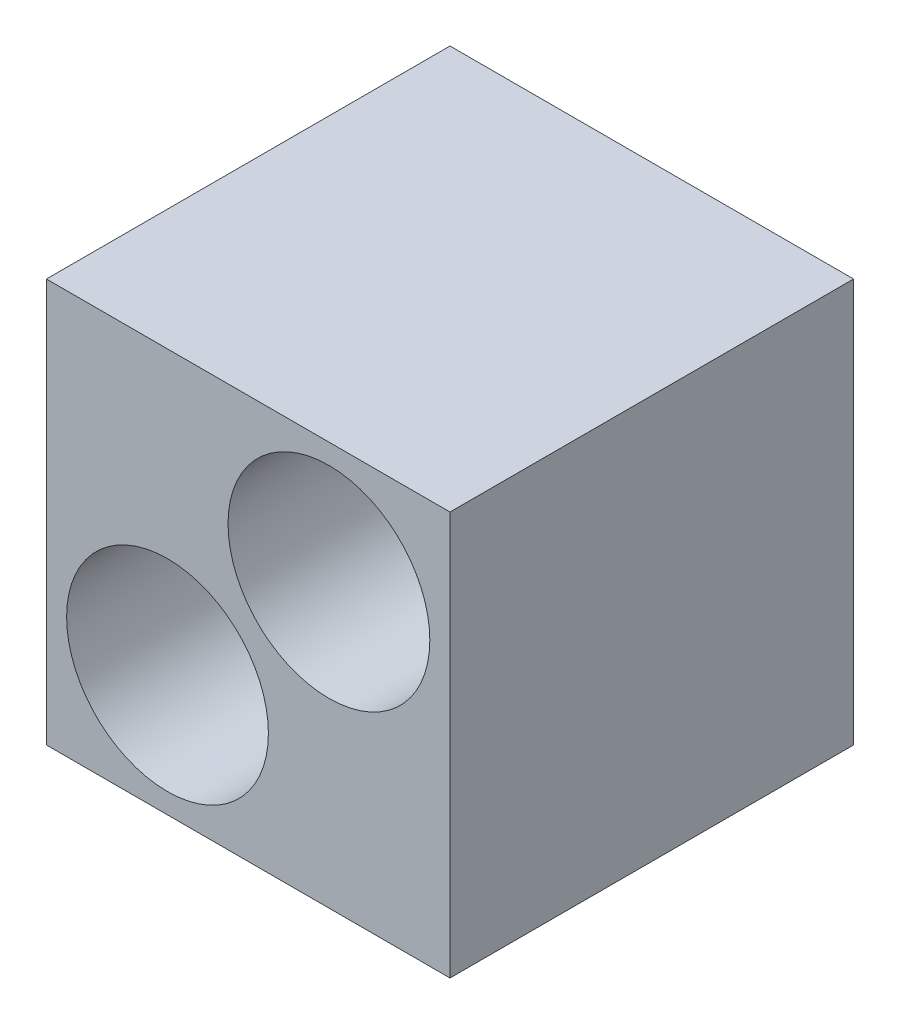
ISO-10303-21;
HEADER;
FILE_DESCRIPTION(('STEP AP214'),'2;1');
FILE_NAME('part.step','',(''),(''),'','','');
FILE_SCHEMA(('AUTOMOTIVE_DESIGN { 1 0 10303 214 1 1 1 1 }'));
ENDSEC;
DATA;
#1=APPLICATION_CONTEXT('core data for automotive mechanical design processes');
#2=APPLICATION_PROTOCOL_DEFINITION('international standard','automotive_design',2000,#1);
#3=PRODUCT_CONTEXT('',#1,'mechanical');
#4=PRODUCT('Part','Part','',(#3));
#5=PRODUCT_RELATED_PRODUCT_CATEGORY('part','',(#4));
#6=PRODUCT_DEFINITION_FORMATION('','',#4);
#7=PRODUCT_DEFINITION_CONTEXT('part definition',#1,'design');
#8=PRODUCT_DEFINITION('design','',#6,#7);
#9=PRODUCT_DEFINITION_SHAPE('','',#8);
#10=(LENGTH_UNIT() NAMED_UNIT(*) SI_UNIT(.MILLI.,.METRE.));
#11=(NAMED_UNIT(*) PLANE_ANGLE_UNIT() SI_UNIT($,.RADIAN.));
#12=(NAMED_UNIT(*) SI_UNIT($,.STERADIAN.) SOLID_ANGLE_UNIT());
#13=UNCERTAINTY_MEASURE_WITH_UNIT(LENGTH_MEASURE(1.E-05),#10,'distance_accuracy_value','');
#14=(GEOMETRIC_REPRESENTATION_CONTEXT(3) GLOBAL_UNCERTAINTY_ASSIGNED_CONTEXT((#13)) GLOBAL_UNIT_ASSIGNED_CONTEXT((#10,
#11,#12)) REPRESENTATION_CONTEXT('',''));
#15=CARTESIAN_POINT('',(0.,0.,0.));
#16=DIRECTION('',(0.,0.,1.));
#17=DIRECTION('',(1.,0.,0.));
#18=AXIS2_PLACEMENT_3D('',#15,#16,#17);
#19=CARTESIAN_POINT('',(0.,10.,10.));
#20=DIRECTION('',(0.,0.,-1.));
#21=DIRECTION('',(-1.,0.,0.));
#22=AXIS2_PLACEMENT_3D('',#19,#20,#21);
#23=PLANE('',#22);
#24=CARTESIAN_POINT('',(3.,3.,10.));
#25=DIRECTION('',(0.,0.,1.));
#26=DIRECTION('',(1.,0.,0.));
#27=AXIS2_PLACEMENT_3D('',#24,#25,#26);
#28=CIRCLE('',#27,2.5);
#29=CARTESIAN_POINT('',(5.5,3.,10.));
#30=VERTEX_POINT('',#29);
#31=EDGE_CURVE('E102',#30,#30,#28,.T.);
#32=ORIENTED_EDGE('',*,*,#31,.F.);
#33=EDGE_LOOP('',(#32));
#34=FACE_BOUND('',#33,.T.);
#35=DIRECTION('',(0.,-1.,0.));
#36=VECTOR('',#35,1.);
#37=CARTESIAN_POINT('',(0.,0.,10.));
#38=LINE('',#37,#36);
#39=CARTESIAN_POINT('',(0.,10.,10.));
#40=VERTEX_POINT('',#39);
#41=CARTESIAN_POINT('',(0.,0.,10.));
#42=VERTEX_POINT('',#41);
#43=EDGE_CURVE('E87',#40,#42,#38,.T.);
#44=ORIENTED_EDGE('',*,*,#43,.T.);
#45=DIRECTION('',(1.,0.,0.));
#46=VECTOR('',#45,1.);
#47=CARTESIAN_POINT('',(0.,0.,10.));
#48=LINE('',#47,#46);
#49=CARTESIAN_POINT('',(10.,0.,10.));
#50=VERTEX_POINT('',#49);
#51=EDGE_CURVE('E82',#42,#50,#48,.T.);
#52=ORIENTED_EDGE('',*,*,#51,.T.);
#53=DIRECTION('',(0.,1.,0.));
#54=VECTOR('',#53,1.);
#55=CARTESIAN_POINT('',(10.,0.,10.));
#56=LINE('',#55,#54);
#57=CARTESIAN_POINT('',(10.,10.,10.));
#58=VERTEX_POINT('',#57);
#59=EDGE_CURVE('E85',#50,#58,#56,.T.);
#60=ORIENTED_EDGE('',*,*,#59,.T.);
#61=DIRECTION('',(-1.,0.,0.));
#62=VECTOR('',#61,1.);
#63=CARTESIAN_POINT('',(0.,10.,10.));
#64=LINE('',#63,#62);
#65=EDGE_CURVE('E52',#58,#40,#64,.T.);
#66=ORIENTED_EDGE('',*,*,#65,.T.);
#67=EDGE_LOOP('',(#44,#52,#60,#66));
#68=FACE_BOUND('',#67,.T.);
#69=CARTESIAN_POINT('',(7.,7.,10.));
#70=DIRECTION('',(0.,0.,1.));
#71=DIRECTION('',(1.,0.,0.));
#72=AXIS2_PLACEMENT_3D('',#69,#70,#71);
#73=CIRCLE('',#72,2.5);
#74=CARTESIAN_POINT('',(9.5,7.,10.));
#75=VERTEX_POINT('',#74);
#76=EDGE_CURVE('E117',#75,#75,#73,.T.);
#77=ORIENTED_EDGE('',*,*,#76,.F.);
#78=EDGE_LOOP('',(#77));
#79=FACE_BOUND('',#78,.T.);
#80=ADVANCED_FACE('F35',(#34,#68,#79),#23,.F.);
#81=CARTESIAN_POINT('',(0.,10.,0.));
#82=DIRECTION('',(0.,0.,-1.));
#83=DIRECTION('',(-1.,0.,0.));
#84=AXIS2_PLACEMENT_3D('',#81,#82,#83);
#85=PLANE('',#84);
#86=CARTESIAN_POINT('',(3.,3.,0.));
#87=DIRECTION('',(0.,0.,1.));
#88=DIRECTION('',(1.,0.,0.));
#89=AXIS2_PLACEMENT_3D('',#86,#87,#88);
#90=CIRCLE('',#89,2.5);
#91=CARTESIAN_POINT('',(5.5,3.,0.));
#92=VERTEX_POINT('',#91);
#93=EDGE_CURVE('E114',#92,#92,#90,.T.);
#94=ORIENTED_EDGE('',*,*,#93,.T.);
#95=EDGE_LOOP('',(#94));
#96=FACE_BOUND('',#95,.T.);
#97=DIRECTION('',(0.,-1.,0.));
#98=VECTOR('',#97,1.);
#99=CARTESIAN_POINT('',(0.,0.,0.));
#100=LINE('',#99,#98);
#101=CARTESIAN_POINT('',(0.,10.,0.));
#102=VERTEX_POINT('',#101);
#103=CARTESIAN_POINT('',(0.,0.,0.));
#104=VERTEX_POINT('',#103);
#105=EDGE_CURVE('E99',#102,#104,#100,.T.);
#106=ORIENTED_EDGE('',*,*,#105,.F.);
#107=DIRECTION('',(-1.,0.,0.));
#108=VECTOR('',#107,1.);
#109=CARTESIAN_POINT('',(0.,10.,0.));
#110=LINE('',#109,#108);
#111=CARTESIAN_POINT('',(10.,10.,0.));
#112=VERTEX_POINT('',#111);
#113=EDGE_CURVE('E75',#112,#102,#110,.T.);
#114=ORIENTED_EDGE('',*,*,#113,.F.);
#115=DIRECTION('',(0.,1.,0.));
#116=VECTOR('',#115,1.);
#117=CARTESIAN_POINT('',(10.,0.,0.));
#118=LINE('',#117,#116);
#119=CARTESIAN_POINT('',(10.,0.,0.));
#120=VERTEX_POINT('',#119);
#121=EDGE_CURVE('E69',#120,#112,#118,.T.);
#122=ORIENTED_EDGE('',*,*,#121,.F.);
#123=DIRECTION('',(1.,0.,0.));
#124=VECTOR('',#123,1.);
#125=CARTESIAN_POINT('',(0.,0.,0.));
#126=LINE('',#125,#124);
#127=EDGE_CURVE('E91',#104,#120,#126,.T.);
#128=ORIENTED_EDGE('',*,*,#127,.F.);
#129=EDGE_LOOP('',(#106,#114,#122,#128));
#130=FACE_BOUND('',#129,.T.);
#131=CARTESIAN_POINT('',(7.,7.,0.));
#132=DIRECTION('',(0.,0.,1.));
#133=DIRECTION('',(1.,0.,0.));
#134=AXIS2_PLACEMENT_3D('',#131,#132,#133);
#135=CIRCLE('',#134,2.5);
#136=CARTESIAN_POINT('',(9.5,7.,0.));
#137=VERTEX_POINT('',#136);
#138=EDGE_CURVE('E120',#137,#137,#135,.T.);
#139=ORIENTED_EDGE('',*,*,#138,.T.);
#140=EDGE_LOOP('',(#139));
#141=FACE_BOUND('',#140,.T.);
#142=ADVANCED_FACE('F110',(#96,#130,#141),#85,.T.);
#143=CARTESIAN_POINT('',(0.,0.,10.));
#144=DIRECTION('',(1.,0.,0.));
#145=DIRECTION('',(0.,0.,-1.));
#146=AXIS2_PLACEMENT_3D('',#143,#144,#145);
#147=PLANE('',#146);
#148=ORIENTED_EDGE('',*,*,#105,.T.);
#149=DIRECTION('',(0.,0.,-1.));
#150=VECTOR('',#149,1.);
#151=CARTESIAN_POINT('',(0.,0.,10.));
#152=LINE('',#151,#150);
#153=EDGE_CURVE('E11',#42,#104,#152,.T.);
#154=ORIENTED_EDGE('',*,*,#153,.F.);
#155=ORIENTED_EDGE('',*,*,#43,.F.);
#156=DIRECTION('',(0.,0.,-1.));
#157=VECTOR('',#156,1.);
#158=CARTESIAN_POINT('',(0.,10.,10.));
#159=LINE('',#158,#157);
#160=EDGE_CURVE('E95',#40,#102,#159,.T.);
#161=ORIENTED_EDGE('',*,*,#160,.T.);
#162=EDGE_LOOP('',(#148,#154,#155,#161));
#163=FACE_BOUND('',#162,.T.);
#164=ADVANCED_FACE('F37',(#163),#147,.F.);
#165=CARTESIAN_POINT('',(0.,0.,10.));
#166=DIRECTION('',(0.,1.,0.));
#167=DIRECTION('',(0.,0.,1.));
#168=AXIS2_PLACEMENT_3D('',#165,#166,#167);
#169=PLANE('',#168);
#170=ORIENTED_EDGE('',*,*,#127,.T.);
#171=DIRECTION('',(0.,0.,-1.));
#172=VECTOR('',#171,1.);
#173=CARTESIAN_POINT('',(10.,0.,10.));
#174=LINE('',#173,#172);
#175=EDGE_CURVE('E44',#50,#120,#174,.T.);
#176=ORIENTED_EDGE('',*,*,#175,.F.);
#177=ORIENTED_EDGE('',*,*,#51,.F.);
#178=ORIENTED_EDGE('',*,*,#153,.T.);
#179=EDGE_LOOP('',(#170,#176,#177,#178));
#180=FACE_BOUND('',#179,.T.);
#181=ADVANCED_FACE('F90',(#180),#169,.F.);
#182=CARTESIAN_POINT('',(10.,0.,10.));
#183=DIRECTION('',(-1.,0.,0.));
#184=DIRECTION('',(0.,0.,1.));
#185=AXIS2_PLACEMENT_3D('',#182,#183,#184);
#186=PLANE('',#185);
#187=ORIENTED_EDGE('',*,*,#121,.T.);
#188=DIRECTION('',(0.,0.,-1.));
#189=VECTOR('',#188,1.);
#190=CARTESIAN_POINT('',(10.,10.,10.));
#191=LINE('',#190,#189);
#192=EDGE_CURVE('E92',#58,#112,#191,.T.);
#193=ORIENTED_EDGE('',*,*,#192,.F.);
#194=ORIENTED_EDGE('',*,*,#59,.F.);
#195=ORIENTED_EDGE('',*,*,#175,.T.);
#196=EDGE_LOOP('',(#187,#193,#194,#195));
#197=FACE_BOUND('',#196,.T.);
#198=ADVANCED_FACE('F93',(#197),#186,.F.);
#199=CARTESIAN_POINT('',(0.,10.,10.));
#200=DIRECTION('',(0.,-1.,0.));
#201=DIRECTION('',(0.,0.,-1.));
#202=AXIS2_PLACEMENT_3D('',#199,#200,#201);
#203=PLANE('',#202);
#204=ORIENTED_EDGE('',*,*,#113,.T.);
#205=ORIENTED_EDGE('',*,*,#160,.F.);
#206=ORIENTED_EDGE('',*,*,#65,.F.);
#207=ORIENTED_EDGE('',*,*,#192,.T.);
#208=EDGE_LOOP('',(#204,#205,#206,#207));
#209=FACE_BOUND('',#208,.T.);
#210=ADVANCED_FACE('F107',(#209),#203,.F.);
#211=CARTESIAN_POINT('',(3.,3.,10.));
#212=DIRECTION('',(0.,0.,-1.));
#213=DIRECTION('',(-1.,0.,0.));
#214=AXIS2_PLACEMENT_3D('',#211,#212,#213);
#215=CYLINDRICAL_SURFACE('',#214,2.5);
#216=ORIENTED_EDGE('',*,*,#31,.T.);
#217=EDGE_LOOP('',(#216));
#218=FACE_BOUND('',#217,.T.);
#219=ORIENTED_EDGE('',*,*,#93,.F.);
#220=EDGE_LOOP('',(#219));
#221=FACE_BOUND('',#220,.T.);
#222=ADVANCED_FACE('F138',(#218,#221),#215,.F.);
#223=CARTESIAN_POINT('',(7.,7.,10.));
#224=DIRECTION('',(0.,0.,-1.));
#225=DIRECTION('',(-1.,0.,0.));
#226=AXIS2_PLACEMENT_3D('',#223,#224,#225);
#227=CYLINDRICAL_SURFACE('',#226,2.5);
#228=ORIENTED_EDGE('',*,*,#76,.T.);
#229=EDGE_LOOP('',(#228));
#230=FACE_BOUND('',#229,.T.);
#231=ORIENTED_EDGE('',*,*,#138,.F.);
#232=EDGE_LOOP('',(#231));
#233=FACE_BOUND('',#232,.T.);
#234=ADVANCED_FACE('F126',(#230,#233),#227,.F.);
#235=CLOSED_SHELL('',(#80,#142,#164,#181,#198,#210,#222,#234));
#236=MANIFOLD_SOLID_BREP('B2',#235);
#237=ADVANCED_BREP_SHAPE_REPRESENTATION('',(#18,#236),#14);
#238=SHAPE_DEFINITION_REPRESENTATION(#9,#237);
ENDSEC;
END-ISO-10303-21;
